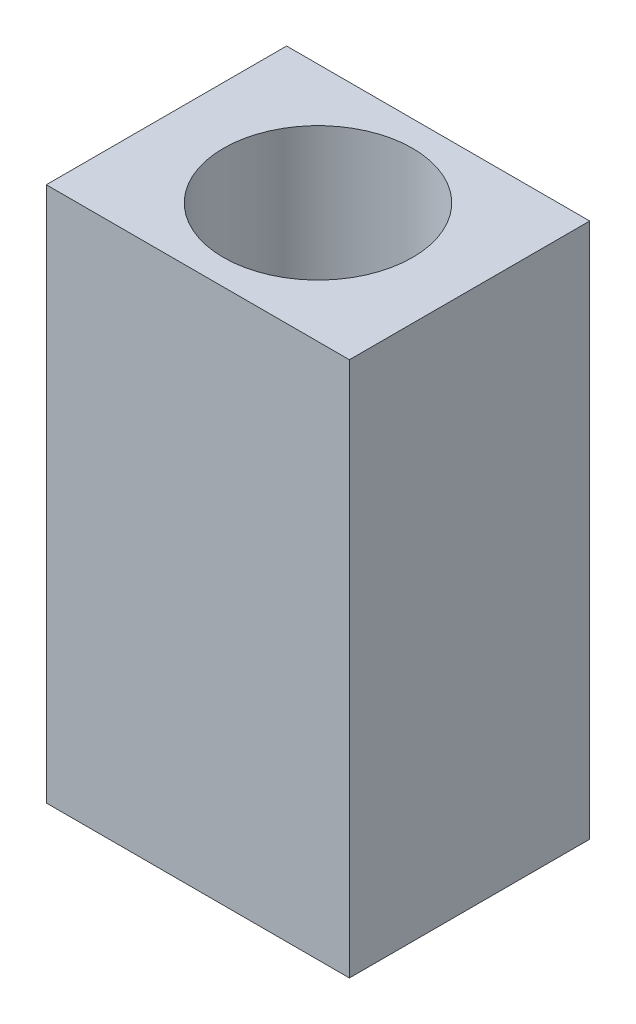
ISO-10303-21;
HEADER;
FILE_DESCRIPTION(('STEP AP214'),'2;1');
FILE_NAME('part.step','',(''),(''),'','','');
FILE_SCHEMA(('AUTOMOTIVE_DESIGN { 1 0 10303 214 1 1 1 1 }'));
ENDSEC;
DATA;
#1=APPLICATION_CONTEXT('core data for automotive mechanical design processes');
#2=APPLICATION_PROTOCOL_DEFINITION('international standard','automotive_design',2000,#1);
#3=PRODUCT_CONTEXT('',#1,'mechanical');
#4=PRODUCT('Part','Part','',(#3));
#5=PRODUCT_RELATED_PRODUCT_CATEGORY('part','',(#4));
#6=PRODUCT_DEFINITION_FORMATION('','',#4);
#7=PRODUCT_DEFINITION_CONTEXT('part definition',#1,'design');
#8=PRODUCT_DEFINITION('design','',#6,#7);
#9=PRODUCT_DEFINITION_SHAPE('','',#8);
#10=(LENGTH_UNIT() NAMED_UNIT(*) SI_UNIT(.MILLI.,.METRE.));
#11=(NAMED_UNIT(*) PLANE_ANGLE_UNIT() SI_UNIT($,.RADIAN.));
#12=(NAMED_UNIT(*) SI_UNIT($,.STERADIAN.) SOLID_ANGLE_UNIT());
#13=UNCERTAINTY_MEASURE_WITH_UNIT(LENGTH_MEASURE(1.E-05),#10,'distance_accuracy_value','');
#14=(GEOMETRIC_REPRESENTATION_CONTEXT(3) GLOBAL_UNCERTAINTY_ASSIGNED_CONTEXT((#13)) GLOBAL_UNIT_ASSIGNED_CONTEXT((#10,
#11,#12)) REPRESENTATION_CONTEXT('',''));
#15=CARTESIAN_POINT('',(0.,0.,0.));
#16=DIRECTION('',(0.,0.,1.));
#17=DIRECTION('',(1.,0.,0.));
#18=AXIS2_PLACEMENT_3D('',#15,#16,#17);
#19=CARTESIAN_POINT('',(0.,15.,0.));
#20=DIRECTION('',(0.,-1.,0.));
#21=DIRECTION('',(0.,0.,-1.));
#22=AXIS2_PLACEMENT_3D('',#19,#20,#21);
#23=PLANE('',#22);
#24=DIRECTION('',(0.,0.,-1.));
#25=VECTOR('',#24,1.);
#26=CARTESIAN_POINT('',(4.24569134303413,15.,3.36609811815364));
#27=LINE('',#26,#25);
#28=CARTESIAN_POINT('',(4.24569134303413,15.,3.36609811815364));
#29=VERTEX_POINT('',#28);
#30=CARTESIAN_POINT('',(4.24569134303413,15.,-3.36609811815364));
#31=VERTEX_POINT('',#30);
#32=EDGE_CURVE('E89',#29,#31,#27,.T.);
#33=ORIENTED_EDGE('',*,*,#32,.T.);
#34=DIRECTION('',(-1.,0.,0.));
#35=VECTOR('',#34,1.);
#36=CARTESIAN_POINT('',(-4.24569134303413,15.,-3.36609811815364));
#37=LINE('',#36,#35);
#38=CARTESIAN_POINT('',(-4.24569134303413,15.,-3.36609811815364));
#39=VERTEX_POINT('',#38);
#40=EDGE_CURVE('E84',#31,#39,#37,.T.);
#41=ORIENTED_EDGE('',*,*,#40,.T.);
#42=DIRECTION('',(0.,0.,1.));
#43=VECTOR('',#42,1.);
#44=CARTESIAN_POINT('',(-4.24569134303413,15.,3.36609811815364));
#45=LINE('',#44,#43);
#46=CARTESIAN_POINT('',(-4.24569134303413,15.,3.36609811815364));
#47=VERTEX_POINT('',#46);
#48=EDGE_CURVE('E87',#39,#47,#45,.T.);
#49=ORIENTED_EDGE('',*,*,#48,.T.);
#50=DIRECTION('',(1.,0.,0.));
#51=VECTOR('',#50,1.);
#52=CARTESIAN_POINT('',(-4.24569134303413,15.,3.36609811815364));
#53=LINE('',#52,#51);
#54=EDGE_CURVE('E54',#47,#29,#53,.T.);
#55=ORIENTED_EDGE('',*,*,#54,.T.);
#56=EDGE_LOOP('',(#33,#41,#49,#55));
#57=FACE_BOUND('',#56,.T.);
#58=CARTESIAN_POINT('',(0.,15.,0.));
#59=DIRECTION('',(0.,1.,0.));
#60=DIRECTION('',(0.,0.,1.));
#61=AXIS2_PLACEMENT_3D('',#58,#59,#60);
#62=CIRCLE('',#61,2.65);
#63=CARTESIAN_POINT('',(0.,15.,2.65));
#64=VERTEX_POINT('',#63);
#65=EDGE_CURVE('E117',#64,#64,#62,.T.);
#66=ORIENTED_EDGE('',*,*,#65,.F.);
#67=EDGE_LOOP('',(#66));
#68=FACE_BOUND('',#67,.T.);
#69=ADVANCED_FACE('F37',(#57,#68),#23,.F.);
#70=CARTESIAN_POINT('',(0.,0.,0.));
#71=DIRECTION('',(0.,-1.,0.));
#72=DIRECTION('',(0.,0.,-1.));
#73=AXIS2_PLACEMENT_3D('',#70,#71,#72);
#74=PLANE('',#73);
#75=CARTESIAN_POINT('',(0.,0.,0.));
#76=DIRECTION('',(0.,1.,0.));
#77=DIRECTION('',(0.,0.,1.));
#78=AXIS2_PLACEMENT_3D('',#75,#76,#77);
#79=CIRCLE('',#78,2.65);
#80=CARTESIAN_POINT('',(0.,0.,2.65));
#81=VERTEX_POINT('',#80);
#82=EDGE_CURVE('E104',#81,#81,#79,.T.);
#83=ORIENTED_EDGE('',*,*,#82,.T.);
#84=EDGE_LOOP('',(#83));
#85=FACE_BOUND('',#84,.T.);
#86=DIRECTION('',(0.,0.,-1.));
#87=VECTOR('',#86,1.);
#88=CARTESIAN_POINT('',(4.24569134303413,0.,3.36609811815364));
#89=LINE('',#88,#87);
#90=CARTESIAN_POINT('',(4.24569134303413,0.,3.36609811815364));
#91=VERTEX_POINT('',#90);
#92=CARTESIAN_POINT('',(4.24569134303413,0.,-3.36609811815364));
#93=VERTEX_POINT('',#92);
#94=EDGE_CURVE('E101',#91,#93,#89,.T.);
#95=ORIENTED_EDGE('',*,*,#94,.F.);
#96=DIRECTION('',(1.,0.,0.));
#97=VECTOR('',#96,1.);
#98=CARTESIAN_POINT('',(-4.24569134303413,0.,3.36609811815364));
#99=LINE('',#98,#97);
#100=CARTESIAN_POINT('',(-4.24569134303413,0.,3.36609811815364));
#101=VERTEX_POINT('',#100);
#102=EDGE_CURVE('E77',#101,#91,#99,.T.);
#103=ORIENTED_EDGE('',*,*,#102,.F.);
#104=DIRECTION('',(0.,0.,1.));
#105=VECTOR('',#104,1.);
#106=CARTESIAN_POINT('',(-4.24569134303413,0.,3.36609811815364));
#107=LINE('',#106,#105);
#108=CARTESIAN_POINT('',(-4.24569134303413,0.,-3.36609811815364));
#109=VERTEX_POINT('',#108);
#110=EDGE_CURVE('E71',#109,#101,#107,.T.);
#111=ORIENTED_EDGE('',*,*,#110,.F.);
#112=DIRECTION('',(-1.,0.,0.));
#113=VECTOR('',#112,1.);
#114=CARTESIAN_POINT('',(-4.24569134303413,0.,-3.36609811815364));
#115=LINE('',#114,#113);
#116=EDGE_CURVE('E93',#93,#109,#115,.T.);
#117=ORIENTED_EDGE('',*,*,#116,.F.);
#118=EDGE_LOOP('',(#95,#103,#111,#117));
#119=FACE_BOUND('',#118,.T.);
#120=ADVANCED_FACE('F112',(#85,#119),#74,.T.);
#121=CARTESIAN_POINT('',(4.24569134303413,15.,3.36609811815364));
#122=DIRECTION('',(-1.,0.,0.));
#123=DIRECTION('',(0.,0.,1.));
#124=AXIS2_PLACEMENT_3D('',#121,#122,#123);
#125=PLANE('',#124);
#126=ORIENTED_EDGE('',*,*,#94,.T.);
#127=DIRECTION('',(0.,-1.,0.));
#128=VECTOR('',#127,1.);
#129=CARTESIAN_POINT('',(4.24569134303413,15.,-3.36609811815364));
#130=LINE('',#129,#128);
#131=EDGE_CURVE('E11',#31,#93,#130,.T.);
#132=ORIENTED_EDGE('',*,*,#131,.F.);
#133=ORIENTED_EDGE('',*,*,#32,.F.);
#134=DIRECTION('',(0.,-1.,0.));
#135=VECTOR('',#134,1.);
#136=CARTESIAN_POINT('',(4.24569134303413,15.,3.36609811815364));
#137=LINE('',#136,#135);
#138=EDGE_CURVE('E97',#29,#91,#137,.T.);
#139=ORIENTED_EDGE('',*,*,#138,.T.);
#140=EDGE_LOOP('',(#126,#132,#133,#139));
#141=FACE_BOUND('',#140,.T.);
#142=ADVANCED_FACE('F39',(#141),#125,.F.);
#143=CARTESIAN_POINT('',(-4.24569134303413,15.,-3.36609811815364));
#144=DIRECTION('',(0.,0.,1.));
#145=DIRECTION('',(1.,0.,0.));
#146=AXIS2_PLACEMENT_3D('',#143,#144,#145);
#147=PLANE('',#146);
#148=ORIENTED_EDGE('',*,*,#116,.T.);
#149=DIRECTION('',(0.,-1.,0.));
#150=VECTOR('',#149,1.);
#151=CARTESIAN_POINT('',(-4.24569134303413,15.,-3.36609811815364));
#152=LINE('',#151,#150);
#153=EDGE_CURVE('E46',#39,#109,#152,.T.);
#154=ORIENTED_EDGE('',*,*,#153,.F.);
#155=ORIENTED_EDGE('',*,*,#40,.F.);
#156=ORIENTED_EDGE('',*,*,#131,.T.);
#157=EDGE_LOOP('',(#148,#154,#155,#156));
#158=FACE_BOUND('',#157,.T.);
#159=ADVANCED_FACE('F92',(#158),#147,.F.);
#160=CARTESIAN_POINT('',(-4.24569134303413,15.,3.36609811815364));
#161=DIRECTION('',(1.,0.,0.));
#162=DIRECTION('',(0.,0.,-1.));
#163=AXIS2_PLACEMENT_3D('',#160,#161,#162);
#164=PLANE('',#163);
#165=ORIENTED_EDGE('',*,*,#110,.T.);
#166=DIRECTION('',(0.,-1.,0.));
#167=VECTOR('',#166,1.);
#168=CARTESIAN_POINT('',(-4.24569134303413,15.,3.36609811815364));
#169=LINE('',#168,#167);
#170=EDGE_CURVE('E94',#47,#101,#169,.T.);
#171=ORIENTED_EDGE('',*,*,#170,.F.);
#172=ORIENTED_EDGE('',*,*,#48,.F.);
#173=ORIENTED_EDGE('',*,*,#153,.T.);
#174=EDGE_LOOP('',(#165,#171,#172,#173));
#175=FACE_BOUND('',#174,.T.);
#176=ADVANCED_FACE('F95',(#175),#164,.F.);
#177=CARTESIAN_POINT('',(-4.24569134303413,15.,3.36609811815364));
#178=DIRECTION('',(0.,0.,-1.));
#179=DIRECTION('',(-1.,0.,0.));
#180=AXIS2_PLACEMENT_3D('',#177,#178,#179);
#181=PLANE('',#180);
#182=ORIENTED_EDGE('',*,*,#102,.T.);
#183=ORIENTED_EDGE('',*,*,#138,.F.);
#184=ORIENTED_EDGE('',*,*,#54,.F.);
#185=ORIENTED_EDGE('',*,*,#170,.T.);
#186=EDGE_LOOP('',(#182,#183,#184,#185));
#187=FACE_BOUND('',#186,.T.);
#188=ADVANCED_FACE('F109',(#187),#181,.F.);
#189=CARTESIAN_POINT('',(0.,15.,0.));
#190=DIRECTION('',(0.,1.,0.));
#191=DIRECTION('',(0.,0.,1.));
#192=AXIS2_PLACEMENT_3D('',#189,#190,#191);
#193=CYLINDRICAL_SURFACE('',#192,2.65);
#194=ORIENTED_EDGE('',*,*,#82,.F.);
#195=EDGE_LOOP('',(#194));
#196=FACE_BOUND('',#195,.T.);
#197=ORIENTED_EDGE('',*,*,#65,.T.);
#198=EDGE_LOOP('',(#197));
#199=FACE_BOUND('',#198,.T.);
#200=ADVANCED_FACE('F121',(#196,#199),#193,.F.);
#201=CLOSED_SHELL('',(#69,#120,#142,#159,#176,#188,#200));
#202=MANIFOLD_SOLID_BREP('B2',#201);
#203=ADVANCED_BREP_SHAPE_REPRESENTATION('',(#18,#202),#14);
#204=SHAPE_DEFINITION_REPRESENTATION(#9,#203);
ENDSEC;
END-ISO-10303-21;
